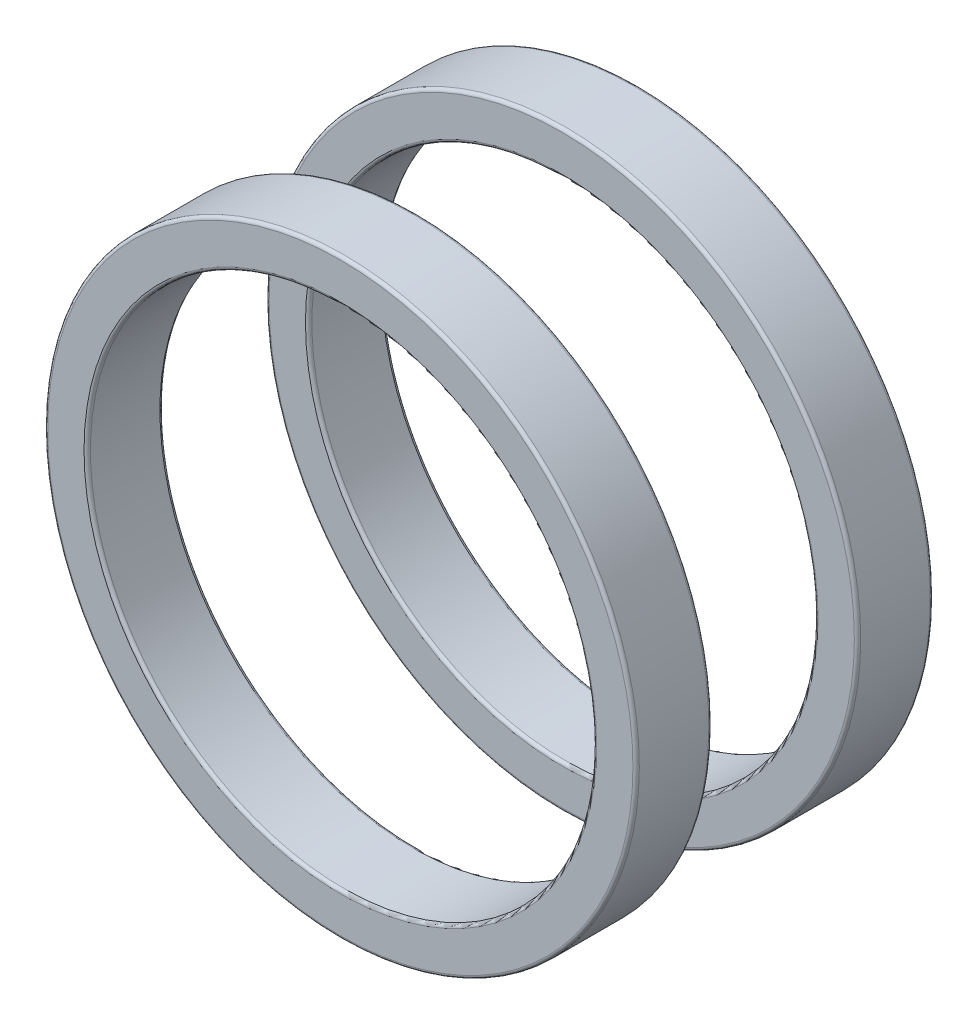
ISO-10303-21;
HEADER;
FILE_DESCRIPTION(('STEP AP214'),'2;1');
FILE_NAME('part.step','',(''),(''),'','','');
FILE_SCHEMA(('AUTOMOTIVE_DESIGN { 1 0 10303 214 1 1 1 1 }'));
ENDSEC;
DATA;
#1=APPLICATION_CONTEXT('core data for automotive mechanical design processes');
#2=APPLICATION_PROTOCOL_DEFINITION('international standard','automotive_design',2000,#1);
#3=PRODUCT_CONTEXT('',#1,'mechanical');
#4=PRODUCT('Part','Part','',(#3));
#5=PRODUCT_RELATED_PRODUCT_CATEGORY('part','',(#4));
#6=PRODUCT_DEFINITION_FORMATION('','',#4);
#7=PRODUCT_DEFINITION_CONTEXT('part definition',#1,'design');
#8=PRODUCT_DEFINITION('design','',#6,#7);
#9=PRODUCT_DEFINITION_SHAPE('','',#8);
#10=(LENGTH_UNIT() NAMED_UNIT(*) SI_UNIT(.MILLI.,.METRE.));
#11=(NAMED_UNIT(*) PLANE_ANGLE_UNIT() SI_UNIT($,.RADIAN.));
#12=(NAMED_UNIT(*) SI_UNIT($,.STERADIAN.) SOLID_ANGLE_UNIT());
#13=UNCERTAINTY_MEASURE_WITH_UNIT(LENGTH_MEASURE(1.E-05),#10,'distance_accuracy_value','');
#14=(GEOMETRIC_REPRESENTATION_CONTEXT(3) GLOBAL_UNCERTAINTY_ASSIGNED_CONTEXT((#13)) GLOBAL_UNIT_ASSIGNED_CONTEXT((#10,
#11,#12)) REPRESENTATION_CONTEXT('',''));
#15=CARTESIAN_POINT('',(0.,0.,0.));
#16=DIRECTION('',(0.,0.,1.));
#17=DIRECTION('',(1.,0.,0.));
#18=AXIS2_PLACEMENT_3D('',#15,#16,#17);
#19=CARTESIAN_POINT('',(0.,0.,1.20800529467736));
#20=DIRECTION('',(0.,0.,1.));
#21=DIRECTION('',(1.,0.,0.));
#22=AXIS2_PLACEMENT_3D('',#19,#20,#21);
#23=TOROIDAL_SURFACE('',#22,4.65423598901099,0.0508);
#24=CARTESIAN_POINT('',(0.,0.,1.20800529467736));
#25=DIRECTION('',(0.,0.,1.));
#26=DIRECTION('',(1.,0.,0.));
#27=AXIS2_PLACEMENT_3D('',#24,#25,#26);
#28=CIRCLE('',#27,4.70503598901099);
#29=CARTESIAN_POINT('',(4.70503598901099,0.,1.20800529467736));
#30=VERTEX_POINT('',#29);
#31=EDGE_CURVE('E68',#30,#30,#28,.T.);
#32=ORIENTED_EDGE('',*,*,#31,.F.);
#33=EDGE_LOOP('',(#32));
#34=FACE_BOUND('',#33,.T.);
#35=CARTESIAN_POINT('',(0.,0.,1.15720529467736));
#36=DIRECTION('',(0.,0.,1.));
#37=DIRECTION('',(1.,0.,0.));
#38=AXIS2_PLACEMENT_3D('',#35,#36,#37);
#39=CIRCLE('',#38,4.65423598901099);
#40=CARTESIAN_POINT('',(4.65423598901099,0.,1.15720529467736));
#41=VERTEX_POINT('',#40);
#42=EDGE_CURVE('E11',#41,#41,#39,.T.);
#43=ORIENTED_EDGE('',*,*,#42,.T.);
#44=EDGE_LOOP('',(#43));
#45=FACE_BOUND('',#44,.T.);
#46=ADVANCED_FACE('F40',(#34,#45),#23,.T.);
#47=CARTESIAN_POINT('',(0.,4.65423598901099,1.15720529467736));
#48=DIRECTION('',(0.,0.,1.));
#49=DIRECTION('',(1.,0.,0.));
#50=AXIS2_PLACEMENT_3D('',#47,#48,#49);
#51=PLANE('',#50);
#52=ORIENTED_EDGE('',*,*,#42,.F.);
#53=EDGE_LOOP('',(#52));
#54=FACE_BOUND('',#53,.T.);
#55=CARTESIAN_POINT('',(0.,0.,1.15720529467736));
#56=DIRECTION('',(0.,0.,1.));
#57=DIRECTION('',(1.,0.,0.));
#58=AXIS2_PLACEMENT_3D('',#55,#56,#57);
#59=CIRCLE('',#58,4.07701401098901);
#60=CARTESIAN_POINT('',(4.07701401098901,0.,1.15720529467736));
#61=VERTEX_POINT('',#60);
#62=EDGE_CURVE('E46',#61,#61,#59,.T.);
#63=ORIENTED_EDGE('',*,*,#62,.T.);
#64=EDGE_LOOP('',(#63));
#65=FACE_BOUND('',#64,.T.);
#66=ADVANCED_FACE('F75',(#54,#65),#51,.F.);
#67=CARTESIAN_POINT('',(0.,0.,1.20800529467736));
#68=DIRECTION('',(0.,0.,1.));
#69=DIRECTION('',(1.,0.,0.));
#70=AXIS2_PLACEMENT_3D('',#67,#68,#69);
#71=TOROIDAL_SURFACE('',#70,4.07701401098901,0.0508);
#72=ORIENTED_EDGE('',*,*,#62,.F.);
#73=EDGE_LOOP('',(#72));
#74=FACE_BOUND('',#73,.T.);
#75=CARTESIAN_POINT('',(0.,0.,1.20800529467736));
#76=DIRECTION('',(0.,0.,1.));
#77=DIRECTION('',(1.,0.,0.));
#78=AXIS2_PLACEMENT_3D('',#75,#76,#77);
#79=CIRCLE('',#78,4.02621401098901);
#80=CARTESIAN_POINT('',(4.02621401098901,0.,1.20800529467736));
#81=VERTEX_POINT('',#80);
#82=EDGE_CURVE('E50',#81,#81,#79,.T.);
#83=ORIENTED_EDGE('',*,*,#82,.T.);
#84=EDGE_LOOP('',(#83));
#85=FACE_BOUND('',#84,.T.);
#86=ADVANCED_FACE('F79',(#74,#85),#71,.T.);
#87=CARTESIAN_POINT('',(0.,0.,2.4892));
#88=DIRECTION('',(0.,0.,1.));
#89=DIRECTION('',(1.,0.,0.));
#90=AXIS2_PLACEMENT_3D('',#87,#88,#89);
#91=CYLINDRICAL_SURFACE('',#90,4.02621401098901);
#92=ORIENTED_EDGE('',*,*,#82,.F.);
#93=EDGE_LOOP('',(#92));
#94=FACE_BOUND('',#93,.T.);
#95=CARTESIAN_POINT('',(0.,0.,2.31394));
#96=DIRECTION('',(0.,0.,1.));
#97=DIRECTION('',(1.,0.,0.));
#98=AXIS2_PLACEMENT_3D('',#95,#96,#97);
#99=CIRCLE('',#98,4.02621401098901);
#100=CARTESIAN_POINT('',(4.02621401098901,0.,2.31394));
#101=VERTEX_POINT('',#100);
#102=EDGE_CURVE('E54',#101,#101,#99,.T.);
#103=ORIENTED_EDGE('',*,*,#102,.T.);
#104=EDGE_LOOP('',(#103));
#105=FACE_BOUND('',#104,.T.);
#106=ADVANCED_FACE('F84',(#94,#105),#91,.F.);
#107=CARTESIAN_POINT('',(0.,0.,2.31394));
#108=DIRECTION('',(0.,0.,1.));
#109=DIRECTION('',(1.,0.,0.));
#110=AXIS2_PLACEMENT_3D('',#107,#108,#109);
#111=TOROIDAL_SURFACE('',#110,4.07701401098901,0.0508000000000002);
#112=ORIENTED_EDGE('',*,*,#102,.F.);
#113=EDGE_LOOP('',(#112));
#114=FACE_BOUND('',#113,.T.);
#115=CARTESIAN_POINT('',(0.,0.,2.36474));
#116=DIRECTION('',(0.,0.,1.));
#117=DIRECTION('',(1.,0.,0.));
#118=AXIS2_PLACEMENT_3D('',#115,#116,#117);
#119=CIRCLE('',#118,4.07701401098901);
#120=CARTESIAN_POINT('',(4.07701401098901,0.,2.36474));
#121=VERTEX_POINT('',#120);
#122=EDGE_CURVE('E59',#121,#121,#119,.T.);
#123=ORIENTED_EDGE('',*,*,#122,.T.);
#124=EDGE_LOOP('',(#123));
#125=FACE_BOUND('',#124,.T.);
#126=ADVANCED_FACE('F90',(#114,#125),#111,.T.);
#127=CARTESIAN_POINT('',(0.,4.65423598901099,2.36474));
#128=DIRECTION('',(0.,0.,-1.));
#129=DIRECTION('',(-1.,0.,0.));
#130=AXIS2_PLACEMENT_3D('',#127,#128,#129);
#131=PLANE('',#130);
#132=ORIENTED_EDGE('',*,*,#122,.F.);
#133=EDGE_LOOP('',(#132));
#134=FACE_BOUND('',#133,.T.);
#135=CARTESIAN_POINT('',(0.,0.,2.36474));
#136=DIRECTION('',(0.,0.,1.));
#137=DIRECTION('',(1.,0.,0.));
#138=AXIS2_PLACEMENT_3D('',#135,#136,#137);
#139=CIRCLE('',#138,4.65423598901099);
#140=CARTESIAN_POINT('',(4.65423598901099,0.,2.36474));
#141=VERTEX_POINT('',#140);
#142=EDGE_CURVE('E62',#141,#141,#139,.T.);
#143=ORIENTED_EDGE('',*,*,#142,.T.);
#144=EDGE_LOOP('',(#143));
#145=FACE_BOUND('',#144,.T.);
#146=ADVANCED_FACE('F94',(#134,#145),#131,.F.);
#147=CARTESIAN_POINT('',(0.,0.,2.31394));
#148=DIRECTION('',(0.,0.,1.));
#149=DIRECTION('',(1.,0.,0.));
#150=AXIS2_PLACEMENT_3D('',#147,#148,#149);
#151=TOROIDAL_SURFACE('',#150,4.65423598901099,0.0508000000000002);
#152=ORIENTED_EDGE('',*,*,#142,.F.);
#153=EDGE_LOOP('',(#152));
#154=FACE_BOUND('',#153,.T.);
#155=CARTESIAN_POINT('',(0.,0.,2.31394));
#156=DIRECTION('',(0.,0.,1.));
#157=DIRECTION('',(1.,0.,0.));
#158=AXIS2_PLACEMENT_3D('',#155,#156,#157);
#159=CIRCLE('',#158,4.70503598901099);
#160=CARTESIAN_POINT('',(4.70503598901099,0.,2.31394));
#161=VERTEX_POINT('',#160);
#162=EDGE_CURVE('E65',#161,#161,#159,.T.);
#163=ORIENTED_EDGE('',*,*,#162,.T.);
#164=EDGE_LOOP('',(#163));
#165=FACE_BOUND('',#164,.T.);
#166=ADVANCED_FACE('F98',(#154,#165),#151,.T.);
#167=CARTESIAN_POINT('',(0.,0.,2.4892));
#168=DIRECTION('',(0.,0.,1.));
#169=DIRECTION('',(1.,0.,0.));
#170=AXIS2_PLACEMENT_3D('',#167,#168,#169);
#171=CYLINDRICAL_SURFACE('',#170,4.70503598901099);
#172=ORIENTED_EDGE('',*,*,#162,.F.);
#173=EDGE_LOOP('',(#172));
#174=FACE_BOUND('',#173,.T.);
#175=ORIENTED_EDGE('',*,*,#31,.T.);
#176=EDGE_LOOP('',(#175));
#177=FACE_BOUND('',#176,.T.);
#178=ADVANCED_FACE('F72',(#174,#177),#171,.T.);
#179=CLOSED_SHELL('',(#46,#66,#86,#106,#126,#146,#166,#178));
#180=MANIFOLD_SOLID_BREP('B2',#179);
#181=CARTESIAN_POINT('',(0.,0.,-2.31394));
#182=DIRECTION('',(0.,0.,1.));
#183=DIRECTION('',(1.,0.,0.));
#184=AXIS2_PLACEMENT_3D('',#181,#182,#183);
#185=TOROIDAL_SURFACE('',#184,4.65423598901099,0.0508000000000002);
#186=CARTESIAN_POINT('',(0.,0.,-2.31394));
#187=DIRECTION('',(0.,0.,1.));
#188=DIRECTION('',(1.,0.,0.));
#189=AXIS2_PLACEMENT_3D('',#186,#187,#188);
#190=CIRCLE('',#189,4.70503598901099);
#191=CARTESIAN_POINT('',(4.70503598901099,0.,-2.31394));
#192=VERTEX_POINT('',#191);
#193=EDGE_CURVE('E189',#192,#192,#190,.T.);
#194=ORIENTED_EDGE('',*,*,#193,.F.);
#195=EDGE_LOOP('',(#194));
#196=FACE_BOUND('',#195,.T.);
#197=CARTESIAN_POINT('',(0.,0.,-2.36474));
#198=DIRECTION('',(0.,0.,1.));
#199=DIRECTION('',(1.,0.,0.));
#200=AXIS2_PLACEMENT_3D('',#197,#198,#199);
#201=CIRCLE('',#200,4.65423598901099);
#202=CARTESIAN_POINT('',(4.65423598901099,0.,-2.36474));
#203=VERTEX_POINT('',#202);
#204=EDGE_CURVE('E39',#203,#203,#201,.T.);
#205=ORIENTED_EDGE('',*,*,#204,.T.);
#206=EDGE_LOOP('',(#205));
#207=FACE_BOUND('',#206,.T.);
#208=ADVANCED_FACE('F161',(#196,#207),#185,.T.);
#209=CARTESIAN_POINT('',(0.,4.65423598901099,-2.36474));
#210=DIRECTION('',(0.,0.,1.));
#211=DIRECTION('',(1.,0.,0.));
#212=AXIS2_PLACEMENT_3D('',#209,#210,#211);
#213=PLANE('',#212);
#214=ORIENTED_EDGE('',*,*,#204,.F.);
#215=EDGE_LOOP('',(#214));
#216=FACE_BOUND('',#215,.T.);
#217=CARTESIAN_POINT('',(0.,0.,-2.36474));
#218=DIRECTION('',(0.,0.,1.));
#219=DIRECTION('',(1.,0.,0.));
#220=AXIS2_PLACEMENT_3D('',#217,#218,#219);
#221=CIRCLE('',#220,4.07701401098901);
#222=CARTESIAN_POINT('',(4.07701401098901,0.,-2.36474));
#223=VERTEX_POINT('',#222);
#224=EDGE_CURVE('E167',#223,#223,#221,.T.);
#225=ORIENTED_EDGE('',*,*,#224,.T.);
#226=EDGE_LOOP('',(#225));
#227=FACE_BOUND('',#226,.T.);
#228=ADVANCED_FACE('F196',(#216,#227),#213,.F.);
#229=CARTESIAN_POINT('',(0.,0.,-2.31394));
#230=DIRECTION('',(0.,0.,1.));
#231=DIRECTION('',(1.,0.,0.));
#232=AXIS2_PLACEMENT_3D('',#229,#230,#231);
#233=TOROIDAL_SURFACE('',#232,4.07701401098901,0.0508000000000002);
#234=ORIENTED_EDGE('',*,*,#224,.F.);
#235=EDGE_LOOP('',(#234));
#236=FACE_BOUND('',#235,.T.);
#237=CARTESIAN_POINT('',(0.,0.,-2.31394));
#238=DIRECTION('',(0.,0.,1.));
#239=DIRECTION('',(1.,0.,0.));
#240=AXIS2_PLACEMENT_3D('',#237,#238,#239);
#241=CIRCLE('',#240,4.02621401098901);
#242=CARTESIAN_POINT('',(4.02621401098901,0.,-2.31394));
#243=VERTEX_POINT('',#242);
#244=EDGE_CURVE('E171',#243,#243,#241,.T.);
#245=ORIENTED_EDGE('',*,*,#244,.T.);
#246=EDGE_LOOP('',(#245));
#247=FACE_BOUND('',#246,.T.);
#248=ADVANCED_FACE('F200',(#236,#247),#233,.T.);
#249=CARTESIAN_POINT('',(0.,0.,2.4892));
#250=DIRECTION('',(0.,0.,1.));
#251=DIRECTION('',(1.,0.,0.));
#252=AXIS2_PLACEMENT_3D('',#249,#250,#251);
#253=CYLINDRICAL_SURFACE('',#252,4.02621401098901);
#254=ORIENTED_EDGE('',*,*,#244,.F.);
#255=EDGE_LOOP('',(#254));
#256=FACE_BOUND('',#255,.T.);
#257=CARTESIAN_POINT('',(0.,0.,-1.20800529467736));
#258=DIRECTION('',(0.,0.,1.));
#259=DIRECTION('',(1.,0.,0.));
#260=AXIS2_PLACEMENT_3D('',#257,#258,#259);
#261=CIRCLE('',#260,4.02621401098901);
#262=CARTESIAN_POINT('',(4.02621401098901,0.,-1.20800529467736));
#263=VERTEX_POINT('',#262);
#264=EDGE_CURVE('E175',#263,#263,#261,.T.);
#265=ORIENTED_EDGE('',*,*,#264,.T.);
#266=EDGE_LOOP('',(#265));
#267=FACE_BOUND('',#266,.T.);
#268=ADVANCED_FACE('F205',(#256,#267),#253,.F.);
#269=CARTESIAN_POINT('',(0.,0.,-1.20800529467736));
#270=DIRECTION('',(0.,0.,1.));
#271=DIRECTION('',(1.,0.,0.));
#272=AXIS2_PLACEMENT_3D('',#269,#270,#271);
#273=TOROIDAL_SURFACE('',#272,4.07701401098901,0.0508);
#274=ORIENTED_EDGE('',*,*,#264,.F.);
#275=EDGE_LOOP('',(#274));
#276=FACE_BOUND('',#275,.T.);
#277=CARTESIAN_POINT('',(0.,0.,-1.15720529467736));
#278=DIRECTION('',(0.,0.,1.));
#279=DIRECTION('',(1.,0.,0.));
#280=AXIS2_PLACEMENT_3D('',#277,#278,#279);
#281=CIRCLE('',#280,4.07701401098901);
#282=CARTESIAN_POINT('',(4.07701401098901,0.,-1.15720529467736));
#283=VERTEX_POINT('',#282);
#284=EDGE_CURVE('E180',#283,#283,#281,.T.);
#285=ORIENTED_EDGE('',*,*,#284,.T.);
#286=EDGE_LOOP('',(#285));
#287=FACE_BOUND('',#286,.T.);
#288=ADVANCED_FACE('F211',(#276,#287),#273,.T.);
#289=CARTESIAN_POINT('',(0.,4.65423598901099,-1.15720529467736));
#290=DIRECTION('',(0.,0.,-1.));
#291=DIRECTION('',(-1.,0.,0.));
#292=AXIS2_PLACEMENT_3D('',#289,#290,#291);
#293=PLANE('',#292);
#294=ORIENTED_EDGE('',*,*,#284,.F.);
#295=EDGE_LOOP('',(#294));
#296=FACE_BOUND('',#295,.T.);
#297=CARTESIAN_POINT('',(0.,0.,-1.15720529467736));
#298=DIRECTION('',(0.,0.,1.));
#299=DIRECTION('',(1.,0.,0.));
#300=AXIS2_PLACEMENT_3D('',#297,#298,#299);
#301=CIRCLE('',#300,4.65423598901099);
#302=CARTESIAN_POINT('',(4.65423598901099,0.,-1.15720529467736));
#303=VERTEX_POINT('',#302);
#304=EDGE_CURVE('E183',#303,#303,#301,.T.);
#305=ORIENTED_EDGE('',*,*,#304,.T.);
#306=EDGE_LOOP('',(#305));
#307=FACE_BOUND('',#306,.T.);
#308=ADVANCED_FACE('F215',(#296,#307),#293,.F.);
#309=CARTESIAN_POINT('',(0.,0.,-1.20800529467736));
#310=DIRECTION('',(0.,0.,1.));
#311=DIRECTION('',(1.,0.,0.));
#312=AXIS2_PLACEMENT_3D('',#309,#310,#311);
#313=TOROIDAL_SURFACE('',#312,4.65423598901099,0.0508);
#314=ORIENTED_EDGE('',*,*,#304,.F.);
#315=EDGE_LOOP('',(#314));
#316=FACE_BOUND('',#315,.T.);
#317=CARTESIAN_POINT('',(0.,0.,-1.20800529467736));
#318=DIRECTION('',(0.,0.,1.));
#319=DIRECTION('',(1.,0.,0.));
#320=AXIS2_PLACEMENT_3D('',#317,#318,#319);
#321=CIRCLE('',#320,4.70503598901099);
#322=CARTESIAN_POINT('',(4.70503598901099,0.,-1.20800529467736));
#323=VERTEX_POINT('',#322);
#324=EDGE_CURVE('E186',#323,#323,#321,.T.);
#325=ORIENTED_EDGE('',*,*,#324,.T.);
#326=EDGE_LOOP('',(#325));
#327=FACE_BOUND('',#326,.T.);
#328=ADVANCED_FACE('F219',(#316,#327),#313,.T.);
#329=CARTESIAN_POINT('',(0.,0.,2.4892));
#330=DIRECTION('',(0.,0.,1.));
#331=DIRECTION('',(1.,0.,0.));
#332=AXIS2_PLACEMENT_3D('',#329,#330,#331);
#333=CYLINDRICAL_SURFACE('',#332,4.70503598901099);
#334=ORIENTED_EDGE('',*,*,#324,.F.);
#335=EDGE_LOOP('',(#334));
#336=FACE_BOUND('',#335,.T.);
#337=ORIENTED_EDGE('',*,*,#193,.T.);
#338=EDGE_LOOP('',(#337));
#339=FACE_BOUND('',#338,.T.);
#340=ADVANCED_FACE('F193',(#336,#339),#333,.T.);
#341=CLOSED_SHELL('',(#208,#228,#248,#268,#288,#308,#328,#340));
#342=MANIFOLD_SOLID_BREP('B6',#341);
#343=ADVANCED_BREP_SHAPE_REPRESENTATION('',(#18,#180,#342),#14);
#344=SHAPE_DEFINITION_REPRESENTATION(#9,#343);
ENDSEC;
END-ISO-10303-21;
